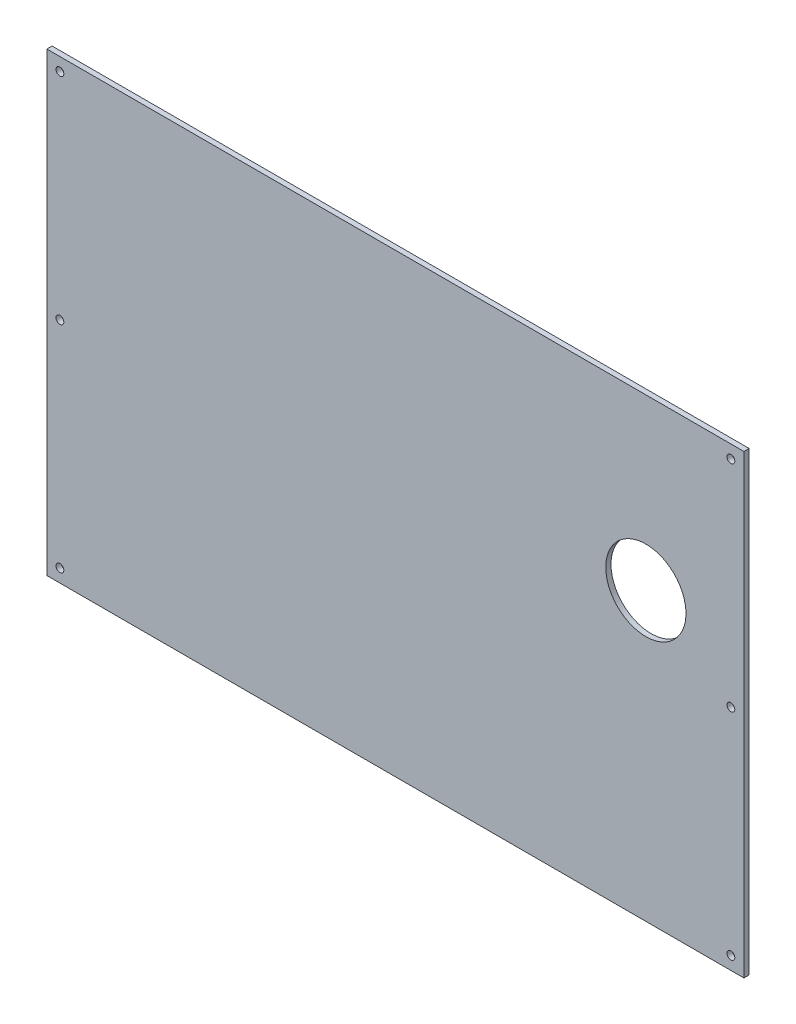
ISO-10303-21;
HEADER;
FILE_DESCRIPTION(('STEP AP214'),'2;1');
FILE_NAME('part.step','',(''),(''),'','','');
FILE_SCHEMA(('AUTOMOTIVE_DESIGN { 1 0 10303 214 1 1 1 1 }'));
ENDSEC;
DATA;
#1=APPLICATION_CONTEXT('core data for automotive mechanical design processes');
#2=APPLICATION_PROTOCOL_DEFINITION('international standard','automotive_design',2000,#1);
#3=PRODUCT_CONTEXT('',#1,'mechanical');
#4=PRODUCT('Part','Part','',(#3));
#5=PRODUCT_RELATED_PRODUCT_CATEGORY('part','',(#4));
#6=PRODUCT_DEFINITION_FORMATION('','',#4);
#7=PRODUCT_DEFINITION_CONTEXT('part definition',#1,'design');
#8=PRODUCT_DEFINITION('design','',#6,#7);
#9=PRODUCT_DEFINITION_SHAPE('','',#8);
#10=(LENGTH_UNIT() NAMED_UNIT(*) SI_UNIT(.MILLI.,.METRE.));
#11=(NAMED_UNIT(*) PLANE_ANGLE_UNIT() SI_UNIT($,.RADIAN.));
#12=(NAMED_UNIT(*) SI_UNIT($,.STERADIAN.) SOLID_ANGLE_UNIT());
#13=UNCERTAINTY_MEASURE_WITH_UNIT(LENGTH_MEASURE(1.E-05),#10,'distance_accuracy_value','');
#14=(GEOMETRIC_REPRESENTATION_CONTEXT(3) GLOBAL_UNCERTAINTY_ASSIGNED_CONTEXT((#13)) GLOBAL_UNIT_ASSIGNED_CONTEXT((#10,
#11,#12)) REPRESENTATION_CONTEXT('',''));
#15=CARTESIAN_POINT('',(0.,0.,0.));
#16=DIRECTION('',(0.,0.,1.));
#17=DIRECTION('',(1.,0.,0.));
#18=AXIS2_PLACEMENT_3D('',#15,#16,#17);
#19=CARTESIAN_POINT('',(0.,0.,4.));
#20=DIRECTION('',(0.,0.,1.));
#21=DIRECTION('',(1.,0.,0.));
#22=AXIS2_PLACEMENT_3D('',#19,#20,#21);
#23=PLANE('',#22);
#24=CARTESIAN_POINT('',(192.248320424687,45.0460244700071,4.));
#25=DIRECTION('',(0.,0.,-1.));
#26=DIRECTION('',(-1.,0.,0.));
#27=AXIS2_PLACEMENT_3D('',#24,#25,#26);
#28=CIRCLE('',#27,30.7766537421716);
#29=CARTESIAN_POINT('',(161.471666682516,45.0460244700071,4.));
#30=VERTEX_POINT('',#29);
#31=EDGE_CURVE('E145',#30,#30,#28,.T.);
#32=ORIENTED_EDGE('',*,*,#31,.T.);
#33=EDGE_LOOP('',(#32));
#34=FACE_BOUND('',#33,.T.);
#35=CARTESIAN_POINT('',(257.5,0.,4.));
#36=DIRECTION('',(0.,0.,1.));
#37=DIRECTION('',(1.,0.,0.));
#38=AXIS2_PLACEMENT_3D('',#35,#36,#37);
#39=CIRCLE('',#38,2.99999999999999);
#40=CARTESIAN_POINT('',(260.5,0.,4.));
#41=VERTEX_POINT('',#40);
#42=EDGE_CURVE('E133',#41,#41,#39,.T.);
#43=ORIENTED_EDGE('',*,*,#42,.F.);
#44=EDGE_LOOP('',(#43));
#45=FACE_BOUND('',#44,.T.);
#46=CARTESIAN_POINT('',(-257.5,-165.,4.));
#47=DIRECTION('',(0.,0.,1.));
#48=DIRECTION('',(1.,0.,0.));
#49=AXIS2_PLACEMENT_3D('',#46,#47,#48);
#50=CIRCLE('',#49,2.99999999999999);
#51=CARTESIAN_POINT('',(-254.5,-165.,4.));
#52=VERTEX_POINT('',#51);
#53=EDGE_CURVE('E121',#52,#52,#50,.T.);
#54=ORIENTED_EDGE('',*,*,#53,.F.);
#55=EDGE_LOOP('',(#54));
#56=FACE_BOUND('',#55,.T.);
#57=CARTESIAN_POINT('',(-257.5,165.,4.));
#58=DIRECTION('',(0.,0.,1.));
#59=DIRECTION('',(1.,0.,0.));
#60=AXIS2_PLACEMENT_3D('',#57,#58,#59);
#61=CIRCLE('',#60,2.99999999999999);
#62=CARTESIAN_POINT('',(-254.5,165.,4.));
#63=VERTEX_POINT('',#62);
#64=EDGE_CURVE('E100',#63,#63,#61,.T.);
#65=ORIENTED_EDGE('',*,*,#64,.F.);
#66=EDGE_LOOP('',(#65));
#67=FACE_BOUND('',#66,.T.);
#68=DIRECTION('',(0.,-1.,0.));
#69=VECTOR('',#68,1.);
#70=CARTESIAN_POINT('',(-267.5,-175.,4.));
#71=LINE('',#70,#69);
#72=CARTESIAN_POINT('',(-267.5,175.,4.));
#73=VERTEX_POINT('',#72);
#74=CARTESIAN_POINT('',(-267.5,-175.,4.));
#75=VERTEX_POINT('',#74);
#76=EDGE_CURVE('E85',#73,#75,#71,.T.);
#77=ORIENTED_EDGE('',*,*,#76,.T.);
#78=DIRECTION('',(1.,0.,0.));
#79=VECTOR('',#78,1.);
#80=CARTESIAN_POINT('',(267.5,-175.,4.));
#81=LINE('',#80,#79);
#82=CARTESIAN_POINT('',(267.5,-175.,4.));
#83=VERTEX_POINT('',#82);
#84=EDGE_CURVE('E80',#75,#83,#81,.T.);
#85=ORIENTED_EDGE('',*,*,#84,.T.);
#86=DIRECTION('',(0.,1.,0.));
#87=VECTOR('',#86,1.);
#88=CARTESIAN_POINT('',(267.5,-175.,4.));
#89=LINE('',#88,#87);
#90=CARTESIAN_POINT('',(267.5,175.,4.));
#91=VERTEX_POINT('',#90);
#92=EDGE_CURVE('E83',#83,#91,#89,.T.);
#93=ORIENTED_EDGE('',*,*,#92,.T.);
#94=DIRECTION('',(-1.,0.,0.));
#95=VECTOR('',#94,1.);
#96=CARTESIAN_POINT('',(267.5,175.,4.));
#97=LINE('',#96,#95);
#98=EDGE_CURVE('E50',#91,#73,#97,.T.);
#99=ORIENTED_EDGE('',*,*,#98,.T.);
#100=EDGE_LOOP('',(#77,#85,#93,#99));
#101=FACE_BOUND('',#100,.T.);
#102=CARTESIAN_POINT('',(-257.5,0.,4.));
#103=DIRECTION('',(0.,0.,1.));
#104=DIRECTION('',(1.,0.,0.));
#105=AXIS2_PLACEMENT_3D('',#102,#103,#104);
#106=CIRCLE('',#105,2.99999999999999);
#107=CARTESIAN_POINT('',(-254.5,0.,4.));
#108=VERTEX_POINT('',#107);
#109=EDGE_CURVE('E115',#108,#108,#106,.T.);
#110=ORIENTED_EDGE('',*,*,#109,.F.);
#111=EDGE_LOOP('',(#110));
#112=FACE_BOUND('',#111,.T.);
#113=CARTESIAN_POINT('',(257.5,165.,4.));
#114=DIRECTION('',(0.,0.,1.));
#115=DIRECTION('',(1.,0.,0.));
#116=AXIS2_PLACEMENT_3D('',#113,#114,#115);
#117=CIRCLE('',#116,2.99999999999999);
#118=CARTESIAN_POINT('',(260.5,165.,4.));
#119=VERTEX_POINT('',#118);
#120=EDGE_CURVE('E127',#119,#119,#117,.T.);
#121=ORIENTED_EDGE('',*,*,#120,.F.);
#122=EDGE_LOOP('',(#121));
#123=FACE_BOUND('',#122,.T.);
#124=CARTESIAN_POINT('',(257.5,-165.,4.));
#125=DIRECTION('',(0.,0.,1.));
#126=DIRECTION('',(1.,0.,0.));
#127=AXIS2_PLACEMENT_3D('',#124,#125,#126);
#128=CIRCLE('',#127,2.99999999999999);
#129=CARTESIAN_POINT('',(260.5,-165.,4.));
#130=VERTEX_POINT('',#129);
#131=EDGE_CURVE('E139',#130,#130,#128,.T.);
#132=ORIENTED_EDGE('',*,*,#131,.F.);
#133=EDGE_LOOP('',(#132));
#134=FACE_BOUND('',#133,.T.);
#135=ADVANCED_FACE('F33',(#34,#45,#56,#67,#101,#112,#123,#134),#23,.T.);
#136=CARTESIAN_POINT('',(0.,0.,0.));
#137=DIRECTION('',(0.,0.,1.));
#138=DIRECTION('',(1.,0.,0.));
#139=AXIS2_PLACEMENT_3D('',#136,#137,#138);
#140=PLANE('',#139);
#141=CARTESIAN_POINT('',(192.248320424687,45.0460244700071,0.));
#142=DIRECTION('',(0.,0.,-1.));
#143=DIRECTION('',(-1.,0.,0.));
#144=AXIS2_PLACEMENT_3D('',#141,#142,#143);
#145=CIRCLE('',#144,30.7766537421716);
#146=CARTESIAN_POINT('',(161.471666682516,45.0460244700071,0.));
#147=VERTEX_POINT('',#146);
#148=EDGE_CURVE('E148',#147,#147,#145,.T.);
#149=ORIENTED_EDGE('',*,*,#148,.F.);
#150=EDGE_LOOP('',(#149));
#151=FACE_BOUND('',#150,.T.);
#152=DIRECTION('',(0.,-1.,0.));
#153=VECTOR('',#152,1.);
#154=CARTESIAN_POINT('',(-267.5,-175.,0.));
#155=LINE('',#154,#153);
#156=CARTESIAN_POINT('',(-267.5,175.,0.));
#157=VERTEX_POINT('',#156);
#158=CARTESIAN_POINT('',(-267.5,-175.,0.));
#159=VERTEX_POINT('',#158);
#160=EDGE_CURVE('E97',#157,#159,#155,.T.);
#161=ORIENTED_EDGE('',*,*,#160,.F.);
#162=DIRECTION('',(-1.,0.,0.));
#163=VECTOR('',#162,1.);
#164=CARTESIAN_POINT('',(267.5,175.,0.));
#165=LINE('',#164,#163);
#166=CARTESIAN_POINT('',(267.5,175.,0.));
#167=VERTEX_POINT('',#166);
#168=EDGE_CURVE('E73',#167,#157,#165,.T.);
#169=ORIENTED_EDGE('',*,*,#168,.F.);
#170=DIRECTION('',(0.,1.,0.));
#171=VECTOR('',#170,1.);
#172=CARTESIAN_POINT('',(267.5,-175.,0.));
#173=LINE('',#172,#171);
#174=CARTESIAN_POINT('',(267.5,-175.,0.));
#175=VERTEX_POINT('',#174);
#176=EDGE_CURVE('E67',#175,#167,#173,.T.);
#177=ORIENTED_EDGE('',*,*,#176,.F.);
#178=DIRECTION('',(1.,0.,0.));
#179=VECTOR('',#178,1.);
#180=CARTESIAN_POINT('',(267.5,-175.,0.));
#181=LINE('',#180,#179);
#182=EDGE_CURVE('E89',#159,#175,#181,.T.);
#183=ORIENTED_EDGE('',*,*,#182,.F.);
#184=EDGE_LOOP('',(#161,#169,#177,#183));
#185=FACE_BOUND('',#184,.T.);
#186=CARTESIAN_POINT('',(-257.5,165.,0.));
#187=DIRECTION('',(0.,0.,1.));
#188=DIRECTION('',(1.,0.,0.));
#189=AXIS2_PLACEMENT_3D('',#186,#187,#188);
#190=CIRCLE('',#189,2.99999999999999);
#191=CARTESIAN_POINT('',(-254.5,165.,0.));
#192=VERTEX_POINT('',#191);
#193=EDGE_CURVE('E112',#192,#192,#190,.T.);
#194=ORIENTED_EDGE('',*,*,#193,.T.);
#195=EDGE_LOOP('',(#194));
#196=FACE_BOUND('',#195,.T.);
#197=CARTESIAN_POINT('',(-257.5,0.,0.));
#198=DIRECTION('',(0.,0.,1.));
#199=DIRECTION('',(1.,0.,0.));
#200=AXIS2_PLACEMENT_3D('',#197,#198,#199);
#201=CIRCLE('',#200,2.99999999999999);
#202=CARTESIAN_POINT('',(-254.5,0.,0.));
#203=VERTEX_POINT('',#202);
#204=EDGE_CURVE('E118',#203,#203,#201,.T.);
#205=ORIENTED_EDGE('',*,*,#204,.T.);
#206=EDGE_LOOP('',(#205));
#207=FACE_BOUND('',#206,.T.);
#208=CARTESIAN_POINT('',(-257.5,-165.,0.));
#209=DIRECTION('',(0.,0.,1.));
#210=DIRECTION('',(1.,0.,0.));
#211=AXIS2_PLACEMENT_3D('',#208,#209,#210);
#212=CIRCLE('',#211,2.99999999999999);
#213=CARTESIAN_POINT('',(-254.5,-165.,0.));
#214=VERTEX_POINT('',#213);
#215=EDGE_CURVE('E124',#214,#214,#212,.T.);
#216=ORIENTED_EDGE('',*,*,#215,.T.);
#217=EDGE_LOOP('',(#216));
#218=FACE_BOUND('',#217,.T.);
#219=CARTESIAN_POINT('',(257.5,165.,0.));
#220=DIRECTION('',(0.,0.,1.));
#221=DIRECTION('',(1.,0.,0.));
#222=AXIS2_PLACEMENT_3D('',#219,#220,#221);
#223=CIRCLE('',#222,2.99999999999999);
#224=CARTESIAN_POINT('',(260.5,165.,0.));
#225=VERTEX_POINT('',#224);
#226=EDGE_CURVE('E130',#225,#225,#223,.T.);
#227=ORIENTED_EDGE('',*,*,#226,.T.);
#228=EDGE_LOOP('',(#227));
#229=FACE_BOUND('',#228,.T.);
#230=CARTESIAN_POINT('',(257.5,0.,0.));
#231=DIRECTION('',(0.,0.,1.));
#232=DIRECTION('',(1.,0.,0.));
#233=AXIS2_PLACEMENT_3D('',#230,#231,#232);
#234=CIRCLE('',#233,2.99999999999999);
#235=CARTESIAN_POINT('',(260.5,0.,0.));
#236=VERTEX_POINT('',#235);
#237=EDGE_CURVE('E136',#236,#236,#234,.T.);
#238=ORIENTED_EDGE('',*,*,#237,.T.);
#239=EDGE_LOOP('',(#238));
#240=FACE_BOUND('',#239,.T.);
#241=CARTESIAN_POINT('',(257.5,-165.,0.));
#242=DIRECTION('',(0.,0.,1.));
#243=DIRECTION('',(1.,0.,0.));
#244=AXIS2_PLACEMENT_3D('',#241,#242,#243);
#245=CIRCLE('',#244,2.99999999999999);
#246=CARTESIAN_POINT('',(260.5,-165.,0.));
#247=VERTEX_POINT('',#246);
#248=EDGE_CURVE('E142',#247,#247,#245,.T.);
#249=ORIENTED_EDGE('',*,*,#248,.T.);
#250=EDGE_LOOP('',(#249));
#251=FACE_BOUND('',#250,.T.);
#252=ADVANCED_FACE('F108',(#151,#185,#196,#207,#218,#229,#240,#251),#140,.F.);
#253=CARTESIAN_POINT('',(-267.5,-175.,4.));
#254=DIRECTION('',(1.,0.,0.));
#255=DIRECTION('',(0.,1.,0.));
#256=AXIS2_PLACEMENT_3D('',#253,#254,#255);
#257=PLANE('',#256);
#258=ORIENTED_EDGE('',*,*,#160,.T.);
#259=DIRECTION('',(0.,0.,-1.));
#260=VECTOR('',#259,1.);
#261=CARTESIAN_POINT('',(-267.5,-175.,4.));
#262=LINE('',#261,#260);
#263=EDGE_CURVE('E11',#75,#159,#262,.T.);
#264=ORIENTED_EDGE('',*,*,#263,.F.);
#265=ORIENTED_EDGE('',*,*,#76,.F.);
#266=DIRECTION('',(0.,0.,-1.));
#267=VECTOR('',#266,1.);
#268=CARTESIAN_POINT('',(-267.5,175.,4.));
#269=LINE('',#268,#267);
#270=EDGE_CURVE('E93',#73,#157,#269,.T.);
#271=ORIENTED_EDGE('',*,*,#270,.T.);
#272=EDGE_LOOP('',(#258,#264,#265,#271));
#273=FACE_BOUND('',#272,.T.);
#274=ADVANCED_FACE('F35',(#273),#257,.F.);
#275=CARTESIAN_POINT('',(267.5,-175.,4.));
#276=DIRECTION('',(0.,1.,0.));
#277=DIRECTION('',(-1.,0.,0.));
#278=AXIS2_PLACEMENT_3D('',#275,#276,#277);
#279=PLANE('',#278);
#280=ORIENTED_EDGE('',*,*,#182,.T.);
#281=DIRECTION('',(0.,0.,-1.));
#282=VECTOR('',#281,1.);
#283=CARTESIAN_POINT('',(267.5,-175.,4.));
#284=LINE('',#283,#282);
#285=EDGE_CURVE('E42',#83,#175,#284,.T.);
#286=ORIENTED_EDGE('',*,*,#285,.F.);
#287=ORIENTED_EDGE('',*,*,#84,.F.);
#288=ORIENTED_EDGE('',*,*,#263,.T.);
#289=EDGE_LOOP('',(#280,#286,#287,#288));
#290=FACE_BOUND('',#289,.T.);
#291=ADVANCED_FACE('F88',(#290),#279,.F.);
#292=CARTESIAN_POINT('',(267.5,-175.,4.));
#293=DIRECTION('',(-1.,0.,0.));
#294=DIRECTION('',(0.,-1.,0.));
#295=AXIS2_PLACEMENT_3D('',#292,#293,#294);
#296=PLANE('',#295);
#297=ORIENTED_EDGE('',*,*,#176,.T.);
#298=DIRECTION('',(0.,0.,-1.));
#299=VECTOR('',#298,1.);
#300=CARTESIAN_POINT('',(267.5,175.,4.));
#301=LINE('',#300,#299);
#302=EDGE_CURVE('E90',#91,#167,#301,.T.);
#303=ORIENTED_EDGE('',*,*,#302,.F.);
#304=ORIENTED_EDGE('',*,*,#92,.F.);
#305=ORIENTED_EDGE('',*,*,#285,.T.);
#306=EDGE_LOOP('',(#297,#303,#304,#305));
#307=FACE_BOUND('',#306,.T.);
#308=ADVANCED_FACE('F91',(#307),#296,.F.);
#309=CARTESIAN_POINT('',(267.5,175.,4.));
#310=DIRECTION('',(0.,-1.,0.));
#311=DIRECTION('',(1.,0.,0.));
#312=AXIS2_PLACEMENT_3D('',#309,#310,#311);
#313=PLANE('',#312);
#314=ORIENTED_EDGE('',*,*,#168,.T.);
#315=ORIENTED_EDGE('',*,*,#270,.F.);
#316=ORIENTED_EDGE('',*,*,#98,.F.);
#317=ORIENTED_EDGE('',*,*,#302,.T.);
#318=EDGE_LOOP('',(#314,#315,#316,#317));
#319=FACE_BOUND('',#318,.T.);
#320=ADVANCED_FACE('F105',(#319),#313,.F.);
#321=CARTESIAN_POINT('',(-257.5,165.,4.));
#322=DIRECTION('',(0.,0.,-1.));
#323=DIRECTION('',(-1.,0.,0.));
#324=AXIS2_PLACEMENT_3D('',#321,#322,#323);
#325=CYLINDRICAL_SURFACE('',#324,2.99999999999999);
#326=ORIENTED_EDGE('',*,*,#64,.T.);
#327=EDGE_LOOP('',(#326));
#328=FACE_BOUND('',#327,.T.);
#329=ORIENTED_EDGE('',*,*,#193,.F.);
#330=EDGE_LOOP('',(#329));
#331=FACE_BOUND('',#330,.T.);
#332=ADVANCED_FACE('F175',(#328,#331),#325,.F.);
#333=CARTESIAN_POINT('',(-257.5,0.,4.));
#334=DIRECTION('',(0.,0.,-1.));
#335=DIRECTION('',(-1.,0.,0.));
#336=AXIS2_PLACEMENT_3D('',#333,#334,#335);
#337=CYLINDRICAL_SURFACE('',#336,2.99999999999999);
#338=ORIENTED_EDGE('',*,*,#109,.T.);
#339=EDGE_LOOP('',(#338));
#340=FACE_BOUND('',#339,.T.);
#341=ORIENTED_EDGE('',*,*,#204,.F.);
#342=EDGE_LOOP('',(#341));
#343=FACE_BOUND('',#342,.T.);
#344=ADVANCED_FACE('F196',(#340,#343),#337,.F.);
#345=CARTESIAN_POINT('',(-257.5,-165.,4.));
#346=DIRECTION('',(0.,0.,-1.));
#347=DIRECTION('',(-1.,0.,0.));
#348=AXIS2_PLACEMENT_3D('',#345,#346,#347);
#349=CYLINDRICAL_SURFACE('',#348,2.99999999999999);
#350=ORIENTED_EDGE('',*,*,#53,.T.);
#351=EDGE_LOOP('',(#350));
#352=FACE_BOUND('',#351,.T.);
#353=ORIENTED_EDGE('',*,*,#215,.F.);
#354=EDGE_LOOP('',(#353));
#355=FACE_BOUND('',#354,.T.);
#356=ADVANCED_FACE('F203',(#352,#355),#349,.F.);
#357=CARTESIAN_POINT('',(257.5,165.,4.));
#358=DIRECTION('',(0.,0.,-1.));
#359=DIRECTION('',(-1.,0.,0.));
#360=AXIS2_PLACEMENT_3D('',#357,#358,#359);
#361=CYLINDRICAL_SURFACE('',#360,2.99999999999999);
#362=ORIENTED_EDGE('',*,*,#120,.T.);
#363=EDGE_LOOP('',(#362));
#364=FACE_BOUND('',#363,.T.);
#365=ORIENTED_EDGE('',*,*,#226,.F.);
#366=EDGE_LOOP('',(#365));
#367=FACE_BOUND('',#366,.T.);
#368=ADVANCED_FACE('F211',(#364,#367),#361,.F.);
#369=CARTESIAN_POINT('',(257.5,0.,4.));
#370=DIRECTION('',(0.,0.,-1.));
#371=DIRECTION('',(-1.,0.,0.));
#372=AXIS2_PLACEMENT_3D('',#369,#370,#371);
#373=CYLINDRICAL_SURFACE('',#372,2.99999999999999);
#374=ORIENTED_EDGE('',*,*,#42,.T.);
#375=EDGE_LOOP('',(#374));
#376=FACE_BOUND('',#375,.T.);
#377=ORIENTED_EDGE('',*,*,#237,.F.);
#378=EDGE_LOOP('',(#377));
#379=FACE_BOUND('',#378,.T.);
#380=ADVANCED_FACE('F219',(#376,#379),#373,.F.);
#381=CARTESIAN_POINT('',(257.5,-165.,4.));
#382=DIRECTION('',(0.,0.,-1.));
#383=DIRECTION('',(-1.,0.,0.));
#384=AXIS2_PLACEMENT_3D('',#381,#382,#383);
#385=CYLINDRICAL_SURFACE('',#384,2.99999999999999);
#386=ORIENTED_EDGE('',*,*,#131,.T.);
#387=EDGE_LOOP('',(#386));
#388=FACE_BOUND('',#387,.T.);
#389=ORIENTED_EDGE('',*,*,#248,.F.);
#390=EDGE_LOOP('',(#389));
#391=FACE_BOUND('',#390,.T.);
#392=ADVANCED_FACE('F159',(#388,#391),#385,.F.);
#393=CARTESIAN_POINT('',(192.248320424687,45.0460244700071,4.));
#394=DIRECTION('',(0.,0.,-1.));
#395=DIRECTION('',(-1.,0.,0.));
#396=AXIS2_PLACEMENT_3D('',#393,#394,#395);
#397=CYLINDRICAL_SURFACE('',#396,30.7766537421716);
#398=ORIENTED_EDGE('',*,*,#31,.F.);
#399=EDGE_LOOP('',(#398));
#400=FACE_BOUND('',#399,.T.);
#401=ORIENTED_EDGE('',*,*,#148,.T.);
#402=EDGE_LOOP('',(#401));
#403=FACE_BOUND('',#402,.T.);
#404=ADVANCED_FACE('F156',(#400,#403),#397,.F.);
#405=CLOSED_SHELL('',(#135,#252,#274,#291,#308,#320,#332,#344,#356,#368,#380,#392,#404));
#406=MANIFOLD_SOLID_BREP('B2',#405);
#407=ADVANCED_BREP_SHAPE_REPRESENTATION('',(#18,#406),#14);
#408=SHAPE_DEFINITION_REPRESENTATION(#9,#407);
ENDSEC;
END-ISO-10303-21;
